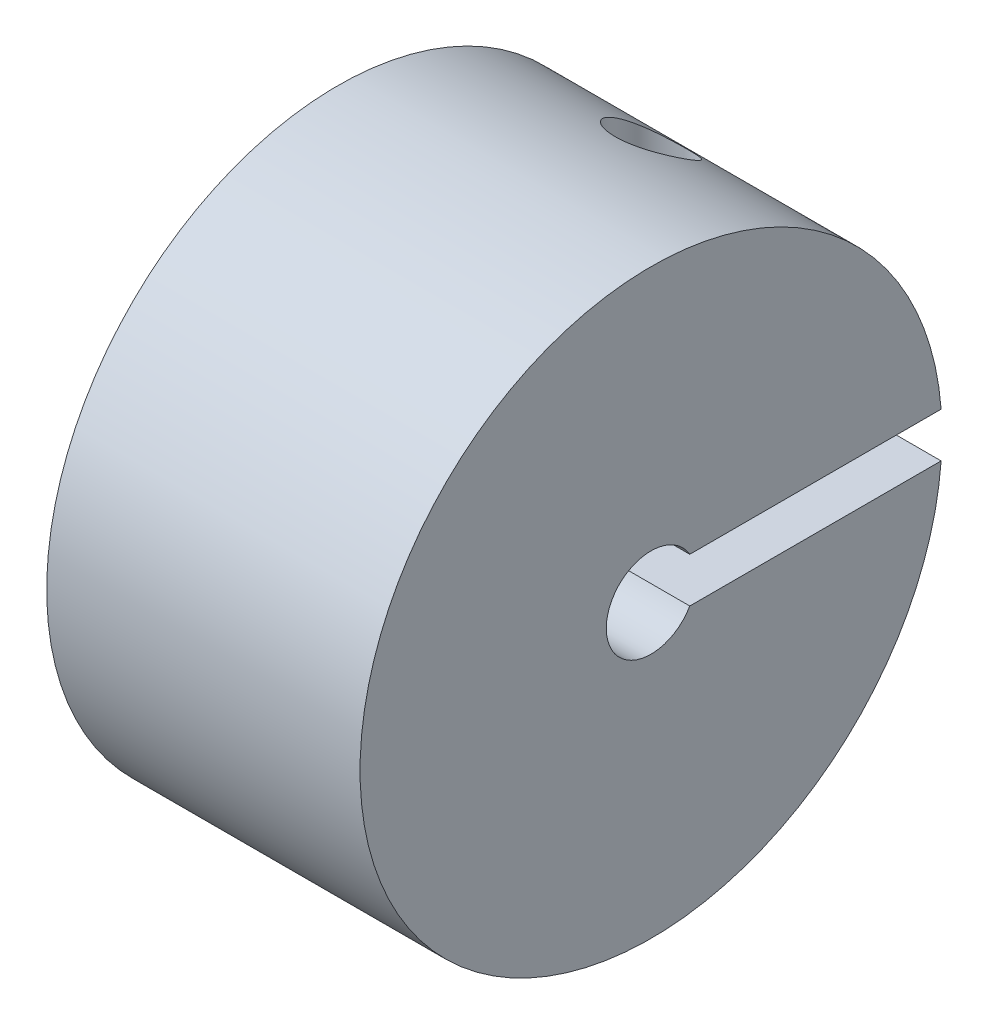
ISO-10303-21;
HEADER;
FILE_DESCRIPTION(('STEP AP214'),'2;1');
FILE_NAME('part.step','',(''),(''),'','','');
FILE_SCHEMA(('AUTOMOTIVE_DESIGN { 1 0 10303 214 1 1 1 1 }'));
ENDSEC;
DATA;
#1=APPLICATION_CONTEXT('core data for automotive mechanical design processes');
#2=APPLICATION_PROTOCOL_DEFINITION('international standard','automotive_design',2000,#1);
#3=PRODUCT_CONTEXT('',#1,'mechanical');
#4=PRODUCT('Part','Part','',(#3));
#5=PRODUCT_RELATED_PRODUCT_CATEGORY('part','',(#4));
#6=PRODUCT_DEFINITION_FORMATION('','',#4);
#7=PRODUCT_DEFINITION_CONTEXT('part definition',#1,'design');
#8=PRODUCT_DEFINITION('design','',#6,#7);
#9=PRODUCT_DEFINITION_SHAPE('','',#8);
#10=(LENGTH_UNIT() NAMED_UNIT(*) SI_UNIT(.MILLI.,.METRE.));
#11=(NAMED_UNIT(*) PLANE_ANGLE_UNIT() SI_UNIT($,.RADIAN.));
#12=(NAMED_UNIT(*) SI_UNIT($,.STERADIAN.) SOLID_ANGLE_UNIT());
#13=UNCERTAINTY_MEASURE_WITH_UNIT(LENGTH_MEASURE(1.E-05),#10,'distance_accuracy_value','');
#14=(GEOMETRIC_REPRESENTATION_CONTEXT(3) GLOBAL_UNCERTAINTY_ASSIGNED_CONTEXT((#13)) GLOBAL_UNIT_ASSIGNED_CONTEXT((#10,
#11,#12)) REPRESENTATION_CONTEXT('',''));
#15=CARTESIAN_POINT('',(0.,0.,0.));
#16=DIRECTION('',(0.,0.,1.));
#17=DIRECTION('',(1.,0.,0.));
#18=AXIS2_PLACEMENT_3D('',#15,#16,#17);
#19=CARTESIAN_POINT('',(7.,0.,0.));
#20=DIRECTION('',(1.,0.,0.));
#21=DIRECTION('',(0.,0.,-1.));
#22=AXIS2_PLACEMENT_3D('',#19,#20,#21);
#23=PLANE('',#22);
#24=CARTESIAN_POINT('',(7.,0.,0.));
#25=DIRECTION('',(1.,0.,0.));
#26=DIRECTION('',(0.,0.,-1.));
#27=AXIS2_PLACEMENT_3D('',#24,#25,#26);
#28=CIRCLE('',#27,6.5);
#29=CARTESIAN_POINT('',(7.,0.5,-6.48074069840786));
#30=VERTEX_POINT('',#29);
#31=CARTESIAN_POINT('',(7.,-0.5,-6.48074069840786));
#32=VERTEX_POINT('',#31);
#33=EDGE_CURVE('E149',#30,#32,#28,.T.);
#34=ORIENTED_EDGE('',*,*,#33,.T.);
#35=DIRECTION('',(0.,0.,-1.));
#36=VECTOR('',#35,1.);
#37=CARTESIAN_POINT('',(7.,-0.5,0.));
#38=LINE('',#37,#36);
#39=CARTESIAN_POINT('',(7.,-0.5,-0.866025403784439));
#40=VERTEX_POINT('',#39);
#41=EDGE_CURVE('E130',#40,#32,#38,.T.);
#42=ORIENTED_EDGE('',*,*,#41,.F.);
#43=CARTESIAN_POINT('',(7.,0.,0.));
#44=DIRECTION('',(1.,0.,0.));
#45=DIRECTION('',(0.,0.,-1.));
#46=AXIS2_PLACEMENT_3D('',#43,#44,#45);
#47=CIRCLE('',#46,1.);
#48=CARTESIAN_POINT('',(7.,0.5,-0.866025403784439));
#49=VERTEX_POINT('',#48);
#50=EDGE_CURVE('E143',#49,#40,#47,.T.);
#51=ORIENTED_EDGE('',*,*,#50,.F.);
#52=DIRECTION('',(0.,0.,1.));
#53=VECTOR('',#52,1.);
#54=CARTESIAN_POINT('',(7.,0.5,0.));
#55=LINE('',#54,#53);
#56=EDGE_CURVE('E132',#30,#49,#55,.T.);
#57=ORIENTED_EDGE('',*,*,#56,.F.);
#58=EDGE_LOOP('',(#34,#42,#51,#57));
#59=FACE_BOUND('',#58,.T.);
#60=ADVANCED_FACE('F37',(#59),#23,.T.);
#61=CARTESIAN_POINT('',(0.,0.,0.));
#62=DIRECTION('',(1.,0.,0.));
#63=DIRECTION('',(0.,0.,-1.));
#64=AXIS2_PLACEMENT_3D('',#61,#62,#63);
#65=PLANE('',#64);
#66=DIRECTION('',(0.,0.,-1.));
#67=VECTOR('',#66,1.);
#68=CARTESIAN_POINT('',(0.,-0.5,0.));
#69=LINE('',#68,#67);
#70=CARTESIAN_POINT('',(0.,-0.5,-0.866025403784439));
#71=VERTEX_POINT('',#70);
#72=CARTESIAN_POINT('',(0.,-0.5,-6.48074069840786));
#73=VERTEX_POINT('',#72);
#74=EDGE_CURVE('E66',#71,#73,#69,.T.);
#75=ORIENTED_EDGE('',*,*,#74,.T.);
#76=CARTESIAN_POINT('',(0.,0.,0.));
#77=DIRECTION('',(1.,0.,0.));
#78=DIRECTION('',(0.,0.,-1.));
#79=AXIS2_PLACEMENT_3D('',#76,#77,#78);
#80=CIRCLE('',#79,6.5);
#81=CARTESIAN_POINT('',(0.,0.5,-6.48074069840786));
#82=VERTEX_POINT('',#81);
#83=EDGE_CURVE('E146',#82,#73,#80,.T.);
#84=ORIENTED_EDGE('',*,*,#83,.F.);
#85=DIRECTION('',(0.,0.,1.));
#86=VECTOR('',#85,1.);
#87=CARTESIAN_POINT('',(0.,0.5,0.));
#88=LINE('',#87,#86);
#89=CARTESIAN_POINT('',(0.,0.5,-0.866025403784439));
#90=VERTEX_POINT('',#89);
#91=EDGE_CURVE('E133',#82,#90,#88,.T.);
#92=ORIENTED_EDGE('',*,*,#91,.T.);
#93=CARTESIAN_POINT('',(0.,0.,0.));
#94=DIRECTION('',(1.,0.,0.));
#95=DIRECTION('',(0.,0.,-1.));
#96=AXIS2_PLACEMENT_3D('',#93,#94,#95);
#97=CIRCLE('',#96,1.);
#98=EDGE_CURVE('E142',#90,#71,#97,.T.);
#99=ORIENTED_EDGE('',*,*,#98,.T.);
#100=EDGE_LOOP('',(#75,#84,#92,#99));
#101=FACE_BOUND('',#100,.T.);
#102=ADVANCED_FACE('F193',(#101),#65,.F.);
#103=CARTESIAN_POINT('',(7.,0.,0.));
#104=DIRECTION('',(-1.,0.,0.));
#105=DIRECTION('',(0.,0.,1.));
#106=AXIS2_PLACEMENT_3D('',#103,#104,#105);
#107=CYLINDRICAL_SURFACE('',#106,6.5);
#108=CARTESIAN_POINT('',(3.5,4.87442304278158,-4.3));
#109=CARTESIAN_POINT('',(3.53741805240954,4.8744246646645,-4.29999844779172));
#110=CARTESIAN_POINT('',(3.57484729066335,4.87676020346921,-4.2973550212475));
#111=CARTESIAN_POINT('',(3.64844006059396,4.88587546192218,-4.28698798569091));
#112=CARTESIAN_POINT('',(3.68460259731303,4.89265859607031,-4.27926047351794));
#113=CARTESIAN_POINT('',(3.75441692417197,4.91001786575494,-4.25933040700899));
#114=CARTESIAN_POINT('',(3.78808332453537,4.92056940529964,-4.24715686009076));
#115=CARTESIAN_POINT('',(3.8525719204991,4.94474894063138,-4.21898121663753));
#116=CARTESIAN_POINT('',(3.88339234526931,4.95837883390766,-4.20297675837315));
#117=CARTESIAN_POINT('',(3.95285796455797,4.99357627258588,-4.16115264331959));
#118=CARTESIAN_POINT('',(3.99010512747203,5.01620400292477,-4.13390265631776));
#119=CARTESIAN_POINT('',(4.05838705045974,5.06443209934547,-4.07467674477587));
#120=CARTESIAN_POINT('',(4.08941282976765,5.09003667962549,-4.04269410252307));
#121=CARTESIAN_POINT('',(4.14565916854378,5.14350027585648,-3.97445762682382));
#122=CARTESIAN_POINT('',(4.17077500675181,5.17138961978135,-3.93814179626757));
#123=CARTESIAN_POINT('',(4.21449211646027,5.22812538972889,-3.86250481590393));
#124=CARTESIAN_POINT('',(4.23309392590916,5.25697173650385,-3.82318391459137));
#125=CARTESIAN_POINT('',(4.26675602743971,5.32074538356273,-3.73406409299271));
#126=CARTESIAN_POINT('',(4.28035426155939,5.35573019399704,-3.68374705732477));
#127=CARTESIAN_POINT('',(4.29760300828521,5.42501894637629,-3.58092416564841));
#128=CARTESIAN_POINT('',(4.30124592669709,5.45932234873389,-3.52841666967536));
#129=CARTESIAN_POINT('',(4.29795565301467,5.52727630181225,-3.421018797129));
#130=CARTESIAN_POINT('',(4.29069944519061,5.56087577593466,-3.366104368063));
#131=CARTESIAN_POINT('',(4.26437781827655,5.62522896486986,-3.25741891937357));
#132=CARTESIAN_POINT('',(4.24532071409614,5.6559846658833,-3.20364712222028));
#133=CARTESIAN_POINT('',(4.19762641887801,5.71066480275609,-3.10502262836541));
#134=CARTESIAN_POINT('',(4.17015509022206,5.73496563322386,-3.05981819301607));
#135=CARTESIAN_POINT('',(4.10562975770654,5.77963171946415,-2.97458714801597));
#136=CARTESIAN_POINT('',(4.06858737341039,5.80000169539756,-2.9345543476239));
#137=CARTESIAN_POINT('',(3.99188070830834,5.83348947472735,-2.86733454335946));
#138=CARTESIAN_POINT('',(3.95338227331607,5.84723124788453,-2.83912596591241));
#139=CARTESIAN_POINT('',(3.87111941546847,5.87098711064122,-2.78967128658937));
#140=CARTESIAN_POINT('',(3.8273593158696,5.88100423328094,-2.76841952136863));
#141=CARTESIAN_POINT('',(3.741210553467,5.89614979744379,-2.73600116109091));
#142=CARTESIAN_POINT('',(3.6992195106013,5.90170083441932,-2.72397016376757));
#143=CARTESIAN_POINT('',(3.61354900259595,5.90955121347922,-2.7068976367947));
#144=CARTESIAN_POINT('',(3.56987024613594,5.91185190547878,-2.70185320554054));
#145=CARTESIAN_POINT('',(3.48470803523438,5.91312009906927,-2.69907608838566));
#146=CARTESIAN_POINT('',(3.44323951679667,5.91226806089708,-2.70094753408307));
#147=CARTESIAN_POINT('',(3.36125419990797,5.90764604499418,-2.71104198316215));
#148=CARTESIAN_POINT('',(3.32073729015092,5.90387641029262,-2.71926423986278));
#149=CARTESIAN_POINT('',(3.24206697765374,5.89352507341162,-2.74162563863153));
#150=CARTESIAN_POINT('',(3.20389905931057,5.88696317089205,-2.75572310599706));
#151=CARTESIAN_POINT('',(3.13059119359073,5.87115098660074,-2.78925222869727));
#152=CARTESIAN_POINT('',(3.09545153549315,5.86190044836132,-2.80868439289633));
#153=CARTESIAN_POINT('',(3.02777953202305,5.84049813751636,-2.85292915252003));
#154=CARTESIAN_POINT('',(2.99538760040323,5.82825347089814,-2.87791103991921));
#155=CARTESIAN_POINT('',(2.93531847846248,5.80129476735274,-2.93187447894946));
#156=CARTESIAN_POINT('',(2.9076425357427,5.78658007902591,-2.96085708529994));
#157=CARTESIAN_POINT('',(2.85543725056916,5.75372655743064,-3.02423517572181));
#158=CARTESIAN_POINT('',(2.83131818824359,5.73541070382881,-3.05887610453389));
#159=CARTESIAN_POINT('',(2.78919447070581,5.69660080746757,-3.13055947614892));
#160=CARTESIAN_POINT('',(2.77119237473919,5.67610585770412,-3.1676029164263));
#161=CARTESIAN_POINT('',(2.73958222560053,5.630876208916,-3.24739359100535));
#162=CARTESIAN_POINT('',(2.72671074232196,5.6059246179374,-3.2903090935271));
#163=CARTESIAN_POINT('',(2.70832761060554,5.55432771097417,-3.37668182890339));
#164=CARTESIAN_POINT('',(2.70281924858048,5.52768164424169,-3.42013929492638));
#165=CARTESIAN_POINT('',(2.69859489341806,5.46961166309781,-3.51236273153766));
#166=CARTESIAN_POINT('',(2.70087389055565,5.43802201823521,-3.56107040960729));
#167=CARTESIAN_POINT('',(2.71403399332227,5.3740931394855,-3.65683550754403));
#168=CARTESIAN_POINT('',(2.72492281638937,5.34175325837805,-3.70389140729614));
#169=CARTESIAN_POINT('',(2.75653094555316,5.27378340684294,-3.80013514688688));
#170=CARTESIAN_POINT('',(2.77815678160471,5.23816193586794,-3.84903379184016));
#171=CARTESIAN_POINT('',(2.83124326991876,5.16832138311876,-3.94231429050651));
#172=CARTESIAN_POINT('',(2.86269888548849,5.13410159326931,-3.98669844200333));
#173=CARTESIAN_POINT('',(2.92709821148237,5.07623043971515,-4.05999391342831));
#174=CARTESIAN_POINT('',(2.95808091093173,5.05194409154516,-4.09012980117331));
#175=CARTESIAN_POINT('',(3.02582817698394,5.006346771767,-4.14581488827148));
#176=CARTESIAN_POINT('',(3.06258396859145,4.98503137569063,-4.17137092471105));
#177=CARTESIAN_POINT('',(3.13340412057905,4.9507374882635,-4.21197759795123));
#178=CARTESIAN_POINT('',(3.1664533728637,4.93694649628707,-4.22810781689091));
#179=CARTESIAN_POINT('',(3.23558154996522,4.91296237580557,-4.25595342846246));
#180=CARTESIAN_POINT('',(3.27165635071538,4.90276444525999,-4.2676747149548));
#181=CARTESIAN_POINT('',(3.33964688729267,4.88814474120013,-4.28440697943318));
#182=CARTESIAN_POINT('',(3.37121569299714,4.88303253160113,-4.29022375346458));
#183=CARTESIAN_POINT('',(3.43518697139962,4.87617128951347,-4.29802058286673));
#184=CARTESIAN_POINT('',(3.46758928952553,4.87442163794155,-4.30000134448935));
#185=CARTESIAN_POINT('',(3.5,4.87442304278158,-4.3));
#186=B_SPLINE_CURVE_WITH_KNOTS('',3,(#108,#109,#110,#111,#112,#113,#114,#115,#116,#117,#118,
#119,#120,#121,#122,#123,#124,#125,#126,#127,#128,#129,#130,#131,#132,#133,#134,#135,#136,#137,
#138,#139,#140,#141,#142,#143,#144,#145,#146,#147,#148,#149,#150,#151,#152,#153,#154,#155,#156,
#157,#158,#159,#160,#161,#162,#163,#164,#165,#166,#167,#168,#169,#170,#171,#172,#173,#174,#175,
#176,#177,#178,#179,#180,#181,#182,#183,#184,#185),.UNSPECIFIED.,.T.,.F.,(4,2,2,2,2,2,2,2,2,2,2,
2,2,2,2,2,2,2,2,2,2,2,2,2,2,2,2,2,2,2,2,2,2,2,2,2,2,2,4),(0.,0.112115665019989,
0.224317504215199,0.33580000970318,0.447351421175378,0.600721462621924,0.754311329594088,
0.910446409412137,1.06656859207412,1.25405264603166,1.44167967821863,1.63497816843524,
1.82814061529771,2.00173798432298,2.17512558288917,2.32328317267245,2.47131984984894,
2.60273619264353,2.73409794027302,2.85806000051736,2.98200748844446,3.10509035203482,
3.22818496029648,3.35573513023884,3.48331899099746,3.62079386003368,3.75832617584435,
3.91156457461773,4.06487134611585,4.23845958909638,4.41220360494192,4.6040614113605,
4.79582107226743,4.94402287890507,5.09200156340663,5.2093807510037,5.32660246369941,
5.42373252056377,5.52084469302117),.UNSPECIFIED.);
#187=CARTESIAN_POINT('',(3.5,4.87442304278158,-4.3));
#188=VERTEX_POINT('',#187);
#189=EDGE_CURVE('E42',#188,#188,#186,.T.);
#190=ORIENTED_EDGE('',*,*,#189,.T.);
#191=EDGE_LOOP('',(#190));
#192=FACE_BOUND('',#191,.T.);
#193=CARTESIAN_POINT('',(1.4,0.,0.));
#194=DIRECTION('',(-1.,0.,0.));
#195=DIRECTION('',(0.,0.,1.));
#196=AXIS2_PLACEMENT_3D('',#193,#194,#195);
#197=CIRCLE('',#196,6.5);
#198=CARTESIAN_POINT('',(1.4,-2.,-6.18465843842649));
#199=VERTEX_POINT('',#198);
#200=CARTESIAN_POINT('',(1.4,-5.47722557505166,-3.5));
#201=VERTEX_POINT('',#200);
#202=EDGE_CURVE('E51',#199,#201,#197,.T.);
#203=ORIENTED_EDGE('',*,*,#202,.T.);
#204=CARTESIAN_POINT('',(1.4,-5.47722557505166,-3.5));
#205=CARTESIAN_POINT('',(1.39999688536292,-5.51326485943082,-3.4436165240546));
#206=CARTESIAN_POINT('',(1.4022715391165,-5.54842917718334,-3.38665296293319));
#207=CARTESIAN_POINT('',(1.41162899230183,-5.61684659535849,-3.27192172570521));
#208=CARTESIAN_POINT('',(1.41871549407365,-5.65009820271542,-3.21415346399259));
#209=CARTESIAN_POINT('',(1.43799214105891,-5.71461376132495,-3.0980032256572));
#210=CARTESIAN_POINT('',(1.45020449899242,-5.74586837112194,-3.03961966932555));
#211=CARTESIAN_POINT('',(1.4799163417902,-5.80604659855023,-2.92303582359459));
#212=CARTESIAN_POINT('',(1.49741452621328,-5.83497078730687,-2.86483549267194));
#213=CARTESIAN_POINT('',(1.55830198191494,-5.91831916108996,-2.69072588022389));
#214=CARTESIAN_POINT('',(1.61000876297278,-5.96905351505599,-2.57579032410849));
#215=CARTESIAN_POINT('',(1.73542400196365,-6.05979871381579,-2.35439363482967));
#216=CARTESIAN_POINT('',(1.80907470106127,-6.09983719301482,-2.24791117265885));
#217=CARTESIAN_POINT('',(1.96801990503269,-6.1660164687005,-2.05893773264377));
#218=CARTESIAN_POINT('',(2.05129842234042,-6.19317130309926,-1.97510278964527));
#219=CARTESIAN_POINT('',(2.23207201599001,-6.23999556608799,-1.82178562607884));
#220=CARTESIAN_POINT('',(2.32957345654249,-6.25966162944334,-1.75230986450391));
#221=CARTESIAN_POINT('',(2.53079338424739,-6.29167113391108,-1.63355094071751));
#222=CARTESIAN_POINT('',(2.63398545802687,-6.30432191720832,-1.58345570321537));
#223=CARTESIAN_POINT('',(2.84756124768064,-6.32454771928859,-1.50064087679255));
#224=CARTESIAN_POINT('',(2.95794322996499,-6.33212395668301,-1.46791711664318));
#225=CARTESIAN_POINT('',(3.18263183983087,-6.34282887769975,-1.4209530139477));
#226=CARTESIAN_POINT('',(3.29693343341676,-6.3459630622261,-1.40668981230806));
#227=CARTESIAN_POINT('',(3.52637838254569,-6.34809714316615,-1.39702834709784));
#228=CARTESIAN_POINT('',(3.64152180616132,-6.34709670146808,-1.40163162634579));
#229=CARTESIAN_POINT('',(3.86983712405973,-6.34085221240593,-1.42961409572032));
#230=CARTESIAN_POINT('',(3.9829997987736,-6.33559195702273,-1.45306499593997));
#231=CARTESIAN_POINT('',(4.203664949464,-6.32033199567423,-1.51806087155864));
#232=CARTESIAN_POINT('',(4.31116772429081,-6.31033254022445,-1.55960489054065));
#233=CARTESIAN_POINT('',(4.51721035753153,-6.28486306197119,-1.65925326337506));
#234=CARTESIAN_POINT('',(4.61576921334538,-6.26940499249262,-1.71732137908641));
#235=CARTESIAN_POINT('',(4.8013975725517,-6.23214618861952,-1.84795814762912));
#236=CARTESIAN_POINT('',(4.88846800394344,-6.21034596698084,-1.92052562805472));
#237=CARTESIAN_POINT('',(5.04855654337525,-6.15971885273861,-2.07716077263971));
#238=CARTESIAN_POINT('',(5.12162141104922,-6.13091609657365,-2.1611885077473));
#239=CARTESIAN_POINT('',(5.25248864416992,-6.06579178652105,-2.33773545669234));
#240=CARTESIAN_POINT('',(5.31029260174295,-6.02947101767168,-2.43025378337288));
#241=CARTESIAN_POINT('',(5.41101228770346,-5.94842593090387,-2.62246720260593));
#242=CARTESIAN_POINT('',(5.45358120787112,-5.90353772933741,-2.72227382744731));
#243=CARTESIAN_POINT('',(5.52225233625156,-5.80630060261712,-2.9239360724508));
#244=CARTESIAN_POINT('',(5.54834549874013,-5.75394759834561,-3.02579278656854));
#245=CARTESIAN_POINT('',(5.57799427984869,-5.66378553598016,-3.19009537379545));
#246=CARTESIAN_POINT('',(5.58634385670517,-5.62798688773305,-3.25284335504079));
#247=CARTESIAN_POINT('',(5.59733769152679,-5.55420720698553,-3.37727995725105));
#248=CARTESIAN_POINT('',(5.60000035328768,-5.51623362386444,-3.43897135255766));
#249=CARTESIAN_POINT('',(5.60000000000044,-5.47722557505171,-3.49999999999995));
#250=B_SPLINE_CURVE_WITH_KNOTS('',3,(#204,#205,#206,#207,#208,#209,#210,#211,#212,#213,#214,
#215,#216,#217,#218,#219,#220,#221,#222,#223,#224,#225,#226,#227,#228,#229,#230,#231,#232,#233,
#234,#235,#236,#237,#238,#239,#240,#241,#242,#243,#244,#245,#246,#247,#248,#249),.UNSPECIFIED.,
.F.,.F.,(4,2,2,2,2,2,2,2,2,2,2,2,2,2,2,2,2,2,2,2,2,2,4),(0.,0.200729994606992,0.401614610491232,
0.603378890292973,0.805093571572787,1.21016738848546,1.6141842859904,1.97605728116782,
2.33809270012035,2.68267262271479,3.02716976751682,3.37123992359172,3.71533821678516,
4.0607519438497,4.40614741427897,4.75079117743701,5.09540708427592,5.43885159738034,
5.78226026574732,6.13305205075311,6.48403626471856,6.7019621807017,6.91918177712486),.UNSPECIFIED.);
#251=CARTESIAN_POINT('',(5.6,-5.47722557505166,-3.5));
#252=VERTEX_POINT('',#251);
#253=EDGE_CURVE('E11',#201,#252,#250,.T.);
#254=ORIENTED_EDGE('',*,*,#253,.T.);
#255=CARTESIAN_POINT('',(5.6,0.,0.));
#256=DIRECTION('',(1.,0.,0.));
#257=DIRECTION('',(0.,0.,-1.));
#258=AXIS2_PLACEMENT_3D('',#255,#256,#257);
#259=CIRCLE('',#258,6.5);
#260=CARTESIAN_POINT('',(5.6,-2.,-6.18465843842649));
#261=VERTEX_POINT('',#260);
#262=EDGE_CURVE('E108',#252,#261,#259,.T.);
#263=ORIENTED_EDGE('',*,*,#262,.T.);
#264=DIRECTION('',(-1.,0.,0.));
#265=VECTOR('',#264,1.);
#266=CARTESIAN_POINT('',(7.,-2.,-6.18465843842649));
#267=LINE('',#266,#265);
#268=EDGE_CURVE('E116',#261,#199,#267,.T.);
#269=ORIENTED_EDGE('',*,*,#268,.T.);
#270=EDGE_LOOP('',(#203,#254,#263,#269));
#271=FACE_BOUND('',#270,.T.);
#272=DIRECTION('',(-1.,0.,0.));
#273=VECTOR('',#272,1.);
#274=CARTESIAN_POINT('',(7.,-0.5,-6.48074069840786));
#275=LINE('',#274,#273);
#276=EDGE_CURVE('E140',#32,#73,#275,.T.);
#277=ORIENTED_EDGE('',*,*,#276,.F.);
#278=ORIENTED_EDGE('',*,*,#33,.F.);
#279=DIRECTION('',(-1.,0.,0.));
#280=VECTOR('',#279,1.);
#281=CARTESIAN_POINT('',(7.,0.5,-6.48074069840786));
#282=LINE('',#281,#280);
#283=EDGE_CURVE('E135',#82,#30,#282,.F.);
#284=ORIENTED_EDGE('',*,*,#283,.F.);
#285=ORIENTED_EDGE('',*,*,#83,.T.);
#286=EDGE_LOOP('',(#277,#278,#284,#285));
#287=FACE_BOUND('',#286,.T.);
#288=ADVANCED_FACE('F39',(#192,#271,#287),#107,.T.);
#289=CARTESIAN_POINT('',(7.,0.,0.));
#290=DIRECTION('',(-1.,0.,0.));
#291=DIRECTION('',(0.,0.,1.));
#292=AXIS2_PLACEMENT_3D('',#289,#290,#291);
#293=CYLINDRICAL_SURFACE('',#292,1.);
#294=ORIENTED_EDGE('',*,*,#50,.T.);
#295=DIRECTION('',(-1.,0.,0.));
#296=VECTOR('',#295,1.);
#297=CARTESIAN_POINT('',(7.,-0.5,-0.866025403784439));
#298=LINE('',#297,#296);
#299=EDGE_CURVE('E157',#40,#71,#298,.T.);
#300=ORIENTED_EDGE('',*,*,#299,.T.);
#301=ORIENTED_EDGE('',*,*,#98,.F.);
#302=DIRECTION('',(-1.,0.,0.));
#303=VECTOR('',#302,1.);
#304=CARTESIAN_POINT('',(7.,0.5,-0.866025403784439));
#305=LINE('',#304,#303);
#306=EDGE_CURVE('E152',#90,#49,#305,.F.);
#307=ORIENTED_EDGE('',*,*,#306,.T.);
#308=EDGE_LOOP('',(#294,#300,#301,#307));
#309=FACE_BOUND('',#308,.T.);
#310=ADVANCED_FACE('F184',(#309),#293,.F.);
#311=CARTESIAN_POINT('',(7.,0.5,0.));
#312=DIRECTION('',(0.,-1.,0.));
#313=DIRECTION('',(0.,0.,-1.));
#314=AXIS2_PLACEMENT_3D('',#311,#312,#313);
#315=PLANE('',#314);
#316=CARTESIAN_POINT('',(3.5,0.5,-3.5));
#317=DIRECTION('',(0.,-1.,0.));
#318=DIRECTION('',(0.,0.,-1.));
#319=AXIS2_PLACEMENT_3D('',#316,#317,#318);
#320=CIRCLE('',#319,0.8);
#321=CARTESIAN_POINT('',(3.5,0.5,-4.3));
#322=VERTEX_POINT('',#321);
#323=EDGE_CURVE('E122',#322,#322,#320,.T.);
#324=ORIENTED_EDGE('',*,*,#323,.F.);
#325=EDGE_LOOP('',(#324));
#326=FACE_BOUND('',#325,.T.);
#327=ORIENTED_EDGE('',*,*,#283,.T.);
#328=ORIENTED_EDGE('',*,*,#56,.T.);
#329=ORIENTED_EDGE('',*,*,#306,.F.);
#330=ORIENTED_EDGE('',*,*,#91,.F.);
#331=EDGE_LOOP('',(#327,#328,#329,#330));
#332=FACE_BOUND('',#331,.T.);
#333=ADVANCED_FACE('F181',(#326,#332),#315,.T.);
#334=CARTESIAN_POINT('',(7.,-0.5,0.));
#335=DIRECTION('',(0.,1.,0.));
#336=DIRECTION('',(0.,0.,1.));
#337=AXIS2_PLACEMENT_3D('',#334,#335,#336);
#338=PLANE('',#337);
#339=CARTESIAN_POINT('',(3.5,-0.5,-3.5));
#340=DIRECTION('',(0.,1.,0.));
#341=DIRECTION('',(0.,0.,1.));
#342=AXIS2_PLACEMENT_3D('',#339,#340,#341);
#343=CIRCLE('',#342,1.25);
#344=CARTESIAN_POINT('',(3.5,-0.5,-2.25));
#345=VERTEX_POINT('',#344);
#346=EDGE_CURVE('E129',#345,#345,#343,.T.);
#347=ORIENTED_EDGE('',*,*,#346,.F.);
#348=EDGE_LOOP('',(#347));
#349=FACE_BOUND('',#348,.T.);
#350=ORIENTED_EDGE('',*,*,#276,.T.);
#351=ORIENTED_EDGE('',*,*,#74,.F.);
#352=ORIENTED_EDGE('',*,*,#299,.F.);
#353=ORIENTED_EDGE('',*,*,#41,.T.);
#354=EDGE_LOOP('',(#350,#351,#352,#353));
#355=FACE_BOUND('',#354,.T.);
#356=ADVANCED_FACE('F179',(#349,#355),#338,.T.);
#357=CARTESIAN_POINT('',(3.5,-6.5,-3.5));
#358=DIRECTION('',(0.,1.,0.));
#359=DIRECTION('',(0.,0.,1.));
#360=AXIS2_PLACEMENT_3D('',#357,#358,#359);
#361=CYLINDRICAL_SURFACE('',#360,1.25);
#362=CARTESIAN_POINT('',(3.5,-2.,-3.5));
#363=DIRECTION('',(0.,1.,0.));
#364=DIRECTION('',(0.,0.,1.));
#365=AXIS2_PLACEMENT_3D('',#362,#363,#364);
#366=CIRCLE('',#365,1.25);
#367=CARTESIAN_POINT('',(3.5,-2.,-2.25));
#368=VERTEX_POINT('',#367);
#369=EDGE_CURVE('E126',#368,#368,#366,.F.);
#370=ORIENTED_EDGE('',*,*,#369,.T.);
#371=EDGE_LOOP('',(#370));
#372=FACE_BOUND('',#371,.T.);
#373=ORIENTED_EDGE('',*,*,#346,.T.);
#374=EDGE_LOOP('',(#373));
#375=FACE_BOUND('',#374,.T.);
#376=ADVANCED_FACE('F175',(#372,#375),#361,.F.);
#377=CARTESIAN_POINT('',(3.5,-6.5,-3.5));
#378=DIRECTION('',(0.,1.,0.));
#379=DIRECTION('',(0.,0.,1.));
#380=AXIS2_PLACEMENT_3D('',#377,#378,#379);
#381=CYLINDRICAL_SURFACE('',#380,2.1);
#382=DIRECTION('',(0.,1.,0.));
#383=VECTOR('',#382,1.);
#384=CARTESIAN_POINT('',(1.4,-6.5,-3.5));
#385=LINE('',#384,#383);
#386=CARTESIAN_POINT('',(1.4,-2.,-3.5));
#387=VERTEX_POINT('',#386);
#388=EDGE_CURVE('E111',#201,#387,#385,.T.);
#389=ORIENTED_EDGE('',*,*,#388,.T.);
#390=CARTESIAN_POINT('',(3.5,-2.,-3.5));
#391=DIRECTION('',(0.,1.,0.));
#392=DIRECTION('',(0.,0.,1.));
#393=AXIS2_PLACEMENT_3D('',#390,#391,#392);
#394=CIRCLE('',#393,2.1);
#395=CARTESIAN_POINT('',(5.6,-2.,-3.5));
#396=VERTEX_POINT('',#395);
#397=EDGE_CURVE('E114',#387,#396,#394,.T.);
#398=ORIENTED_EDGE('',*,*,#397,.T.);
#399=DIRECTION('',(0.,1.,0.));
#400=VECTOR('',#399,1.);
#401=CARTESIAN_POINT('',(5.6,-6.5,-3.5));
#402=LINE('',#401,#400);
#403=EDGE_CURVE('E103',#252,#396,#402,.T.);
#404=ORIENTED_EDGE('',*,*,#403,.F.);
#405=ORIENTED_EDGE('',*,*,#253,.F.);
#406=EDGE_LOOP('',(#389,#398,#404,#405));
#407=FACE_BOUND('',#406,.T.);
#408=ADVANCED_FACE('F118',(#407),#381,.F.);
#409=CARTESIAN_POINT('',(1.4,-6.5,-3.5));
#410=DIRECTION('',(-1.,0.,0.));
#411=DIRECTION('',(0.,0.,1.));
#412=AXIS2_PLACEMENT_3D('',#409,#410,#411);
#413=PLANE('',#412);
#414=DIRECTION('',(0.,0.,1.));
#415=VECTOR('',#414,1.);
#416=CARTESIAN_POINT('',(1.4,-2.,-3.5));
#417=LINE('',#416,#415);
#418=EDGE_CURVE('E58',#199,#387,#417,.T.);
#419=ORIENTED_EDGE('',*,*,#418,.T.);
#420=ORIENTED_EDGE('',*,*,#388,.F.);
#421=ORIENTED_EDGE('',*,*,#202,.F.);
#422=EDGE_LOOP('',(#419,#420,#421));
#423=FACE_BOUND('',#422,.T.);
#424=ADVANCED_FACE('F174',(#423),#413,.F.);
#425=CARTESIAN_POINT('',(5.6,-6.5,-9.01417959782691));
#426=DIRECTION('',(1.,0.,0.));
#427=DIRECTION('',(0.,0.,-1.));
#428=AXIS2_PLACEMENT_3D('',#425,#426,#427);
#429=PLANE('',#428);
#430=ORIENTED_EDGE('',*,*,#403,.T.);
#431=DIRECTION('',(0.,0.,-1.));
#432=VECTOR('',#431,1.);
#433=CARTESIAN_POINT('',(5.6,-2.,-9.01417959782691));
#434=LINE('',#433,#432);
#435=EDGE_CURVE('E106',#396,#261,#434,.T.);
#436=ORIENTED_EDGE('',*,*,#435,.T.);
#437=ORIENTED_EDGE('',*,*,#262,.F.);
#438=EDGE_LOOP('',(#430,#436,#437));
#439=FACE_BOUND('',#438,.T.);
#440=ADVANCED_FACE('F105',(#439),#429,.F.);
#441=CARTESIAN_POINT('',(3.5,-2.,-3.5));
#442=DIRECTION('',(0.,1.,0.));
#443=DIRECTION('',(0.,0.,1.));
#444=AXIS2_PLACEMENT_3D('',#441,#442,#443);
#445=PLANE('',#444);
#446=ORIENTED_EDGE('',*,*,#369,.F.);
#447=EDGE_LOOP('',(#446));
#448=FACE_BOUND('',#447,.T.);
#449=ORIENTED_EDGE('',*,*,#435,.F.);
#450=ORIENTED_EDGE('',*,*,#397,.F.);
#451=ORIENTED_EDGE('',*,*,#418,.F.);
#452=ORIENTED_EDGE('',*,*,#268,.F.);
#453=EDGE_LOOP('',(#449,#450,#451,#452));
#454=FACE_BOUND('',#453,.T.);
#455=ADVANCED_FACE('F113',(#448,#454),#445,.F.);
#456=CARTESIAN_POINT('',(3.5,0.5,-3.5));
#457=DIRECTION('',(0.,-1.,0.));
#458=DIRECTION('',(0.,0.,-1.));
#459=AXIS2_PLACEMENT_3D('',#456,#457,#458);
#460=CYLINDRICAL_SURFACE('',#459,0.799999999999999);
#461=ORIENTED_EDGE('',*,*,#323,.T.);
#462=EDGE_LOOP('',(#461));
#463=FACE_BOUND('',#462,.T.);
#464=ORIENTED_EDGE('',*,*,#189,.F.);
#465=EDGE_LOOP('',(#464));
#466=FACE_BOUND('',#465,.T.);
#467=ADVANCED_FACE('F222',(#463,#466),#460,.F.);
#468=CLOSED_SHELL('',(#60,#102,#288,#310,#333,#356,#376,#408,#424,#440,#455,#467));
#469=MANIFOLD_SOLID_BREP('B2',#468);
#470=ADVANCED_BREP_SHAPE_REPRESENTATION('',(#18,#469),#14);
#471=SHAPE_DEFINITION_REPRESENTATION(#9,#470);
ENDSEC;
END-ISO-10303-21;
